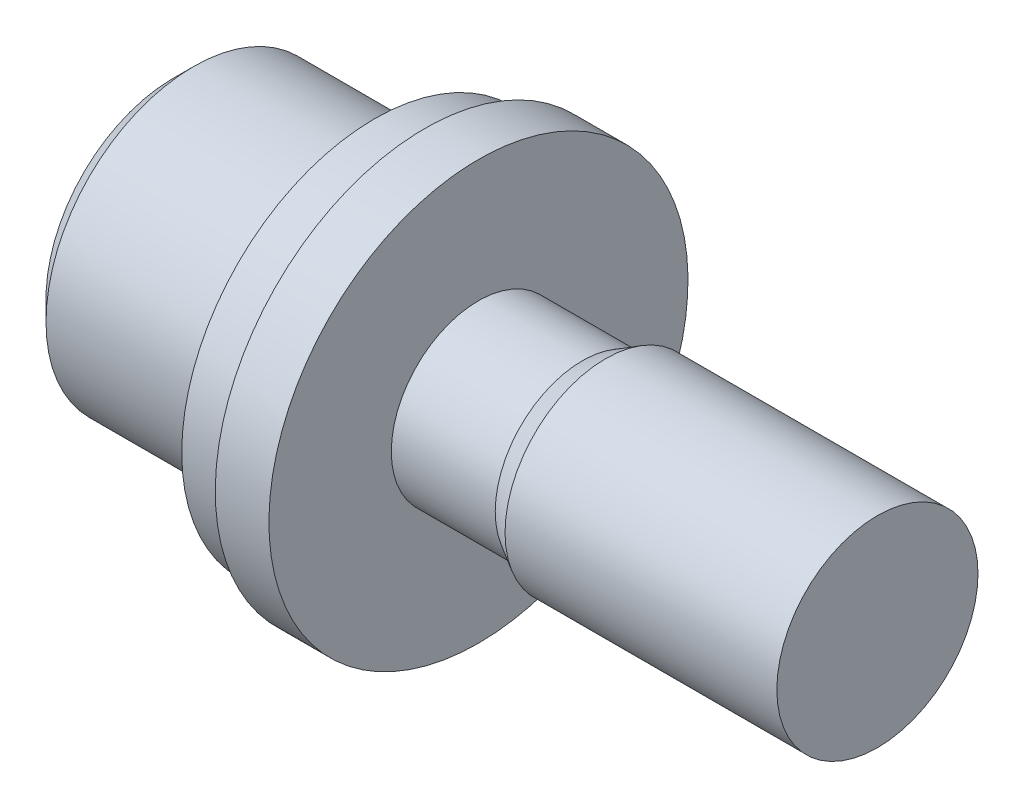
ISO-10303-21;
HEADER;
FILE_DESCRIPTION(('STEP AP214'),'2;1');
FILE_NAME('part.step','',(''),(''),'','','');
FILE_SCHEMA(('AUTOMOTIVE_DESIGN { 1 0 10303 214 1 1 1 1 }'));
ENDSEC;
DATA;
#1=APPLICATION_CONTEXT('core data for automotive mechanical design processes');
#2=APPLICATION_PROTOCOL_DEFINITION('international standard','automotive_design',2000,#1);
#3=PRODUCT_CONTEXT('',#1,'mechanical');
#4=PRODUCT('Part','Part','',(#3));
#5=PRODUCT_RELATED_PRODUCT_CATEGORY('part','',(#4));
#6=PRODUCT_DEFINITION_FORMATION('','',#4);
#7=PRODUCT_DEFINITION_CONTEXT('part definition',#1,'design');
#8=PRODUCT_DEFINITION('design','',#6,#7);
#9=PRODUCT_DEFINITION_SHAPE('','',#8);
#10=(LENGTH_UNIT() NAMED_UNIT(*) SI_UNIT(.MILLI.,.METRE.));
#11=(NAMED_UNIT(*) PLANE_ANGLE_UNIT() SI_UNIT($,.RADIAN.));
#12=(NAMED_UNIT(*) SI_UNIT($,.STERADIAN.) SOLID_ANGLE_UNIT());
#13=UNCERTAINTY_MEASURE_WITH_UNIT(LENGTH_MEASURE(1.E-05),#10,'distance_accuracy_value','');
#14=(GEOMETRIC_REPRESENTATION_CONTEXT(3) GLOBAL_UNCERTAINTY_ASSIGNED_CONTEXT((#13)) GLOBAL_UNIT_ASSIGNED_CONTEXT((#10,
#11,#12)) REPRESENTATION_CONTEXT('',''));
#15=CARTESIAN_POINT('',(0.,0.,0.));
#16=DIRECTION('',(0.,0.,1.));
#17=DIRECTION('',(1.,0.,0.));
#18=AXIS2_PLACEMENT_3D('',#15,#16,#17);
#19=CARTESIAN_POINT('',(-6.1,0.,0.));
#20=DIRECTION('',(-1.,0.,0.));
#21=DIRECTION('',(0.,0.,1.));
#22=AXIS2_PLACEMENT_3D('',#19,#20,#21);
#23=PLANE('',#22);
#24=DIRECTION('',(0.,0.499999999999984,-0.866025403784448));
#25=VECTOR('',#24,1.);
#26=CARTESIAN_POINT('',(-6.1,1.44337567297406,2.5));
#27=LINE('',#26,#25);
#28=CARTESIAN_POINT('',(-6.09999999999998,1.44337567297407,2.49999999999998));
#29=VERTEX_POINT('',#28);
#30=CARTESIAN_POINT('',(-6.10000000000177,2.1650635094601,1.24999999999942));
#31=VERTEX_POINT('',#30);
#32=EDGE_CURVE('E110',#29,#31,#27,.T.);
#33=ORIENTED_EDGE('',*,*,#32,.T.);
#34=CARTESIAN_POINT('',(-6.10000000000355,0.,0.));
#35=DIRECTION('',(-1.,0.,0.));
#36=DIRECTION('',(0.,0.,1.));
#37=AXIS2_PLACEMENT_3D('',#34,#35,#36);
#38=CIRCLE('',#37,2.49999999999773);
#39=CARTESIAN_POINT('',(-6.10000000000177,0.,2.49999999999885));
#40=VERTEX_POINT('',#39);
#41=EDGE_CURVE('E20',#31,#40,#38,.F.);
#42=ORIENTED_EDGE('',*,*,#41,.T.);
#43=DIRECTION('',(0.,1.,0.));
#44=VECTOR('',#43,1.);
#45=CARTESIAN_POINT('',(-6.1,0.,2.49999999999997));
#46=LINE('',#45,#44);
#47=EDGE_CURVE('E111',#40,#29,#46,.T.);
#48=ORIENTED_EDGE('',*,*,#47,.T.);
#49=EDGE_LOOP('',(#33,#42,#48));
#50=FACE_BOUND('',#49,.T.);
#51=ADVANCED_FACE('F17',(#50),#23,.T.);
#52=CARTESIAN_POINT('',(-6.1,0.,0.));
#53=DIRECTION('',(-1.,0.,0.));
#54=DIRECTION('',(0.,0.,1.));
#55=AXIS2_PLACEMENT_3D('',#52,#53,#54);
#56=PLANE('',#55);
#57=DIRECTION('',(0.,1.,0.));
#58=VECTOR('',#57,1.);
#59=CARTESIAN_POINT('',(-6.1,0.,2.5));
#60=LINE('',#59,#58);
#61=CARTESIAN_POINT('',(-6.09999999999998,-1.44337567297406,2.5));
#62=VERTEX_POINT('',#61);
#63=EDGE_CURVE('E89',#62,#40,#60,.T.);
#64=ORIENTED_EDGE('',*,*,#63,.T.);
#65=CARTESIAN_POINT('',(-6.10000000000355,0.,0.));
#66=DIRECTION('',(-1.,0.,0.));
#67=DIRECTION('',(0.,0.,1.));
#68=AXIS2_PLACEMENT_3D('',#65,#66,#67);
#69=CIRCLE('',#68,2.49999999999773);
#70=CARTESIAN_POINT('',(-6.10000000000177,-2.1650635094601,1.24999999999942));
#71=VERTEX_POINT('',#70);
#72=EDGE_CURVE('E121',#40,#71,#69,.F.);
#73=ORIENTED_EDGE('',*,*,#72,.T.);
#74=DIRECTION('',(0.,0.499999999999984,0.866025403784448));
#75=VECTOR('',#74,1.);
#76=CARTESIAN_POINT('',(-6.1,-2.16506350946107,1.24999999999999));
#77=LINE('',#76,#75);
#78=EDGE_CURVE('E112',#71,#62,#77,.T.);
#79=ORIENTED_EDGE('',*,*,#78,.T.);
#80=EDGE_LOOP('',(#64,#73,#79));
#81=FACE_BOUND('',#80,.T.);
#82=ADVANCED_FACE('F185',(#81),#56,.T.);
#83=CARTESIAN_POINT('',(-6.1,0.,0.));
#84=DIRECTION('',(-1.,0.,0.));
#85=DIRECTION('',(0.,0.,1.));
#86=AXIS2_PLACEMENT_3D('',#83,#84,#85);
#87=PLANE('',#86);
#88=DIRECTION('',(0.,-0.499999999999985,0.866025403784448));
#89=VECTOR('',#88,1.);
#90=CARTESIAN_POINT('',(-6.1,-1.44337567297406,-2.5));
#91=LINE('',#90,#89);
#92=CARTESIAN_POINT('',(-6.09999999999998,-1.44337567297407,-2.49999999999998));
#93=VERTEX_POINT('',#92);
#94=CARTESIAN_POINT('',(-6.10000000000177,-2.1650635094601,-1.24999999999942));
#95=VERTEX_POINT('',#94);
#96=EDGE_CURVE('E122',#93,#95,#91,.T.);
#97=ORIENTED_EDGE('',*,*,#96,.T.);
#98=CARTESIAN_POINT('',(-6.10000000000355,0.,0.));
#99=DIRECTION('',(-1.,0.,0.));
#100=DIRECTION('',(0.,0.,1.));
#101=AXIS2_PLACEMENT_3D('',#98,#99,#100);
#102=CIRCLE('',#101,2.49999999999773);
#103=CARTESIAN_POINT('',(-6.10000000000177,0.,-2.49999999999885));
#104=VERTEX_POINT('',#103);
#105=EDGE_CURVE('E106',#95,#104,#102,.F.);
#106=ORIENTED_EDGE('',*,*,#105,.T.);
#107=DIRECTION('',(0.,1.,0.));
#108=VECTOR('',#107,1.);
#109=CARTESIAN_POINT('',(-6.1,0.,-2.49999999999997));
#110=LINE('',#109,#108);
#111=EDGE_CURVE('E124',#104,#93,#110,.F.);
#112=ORIENTED_EDGE('',*,*,#111,.T.);
#113=EDGE_LOOP('',(#97,#106,#112));
#114=FACE_BOUND('',#113,.T.);
#115=ADVANCED_FACE('F187',(#114),#87,.T.);
#116=CARTESIAN_POINT('',(-6.10000000000355,0.,0.));
#117=DIRECTION('',(-1.,0.,0.));
#118=DIRECTION('',(0.,0.,1.));
#119=AXIS2_PLACEMENT_3D('',#116,#117,#118);
#120=CONICAL_SURFACE('',#119,2.49999999999773,1.04719755112176);
#121=CARTESIAN_POINT('',(-4.65662432699787,5.68431684750416E-11,0.));
#122=VERTEX_POINT('',#121);
#123=VERTEX_LOOP('',#122);
#124=FACE_BOUND('',#123,.T.);
#125=ORIENTED_EDGE('',*,*,#41,.F.);
#126=CARTESIAN_POINT('',(-6.10000000000355,0.,0.));
#127=DIRECTION('',(-1.,0.,0.));
#128=DIRECTION('',(0.,0.,1.));
#129=AXIS2_PLACEMENT_3D('',#126,#127,#128);
#130=CIRCLE('',#129,2.49999999999773);
#131=CARTESIAN_POINT('',(-6.10000000000169,2.16506350946011,-1.24999999999943));
#132=VERTEX_POINT('',#131);
#133=EDGE_CURVE('E95',#132,#31,#130,.F.);
#134=ORIENTED_EDGE('',*,*,#133,.F.);
#135=CARTESIAN_POINT('',(-6.10000000000355,0.,0.));
#136=DIRECTION('',(-1.,0.,0.));
#137=DIRECTION('',(0.,0.,1.));
#138=AXIS2_PLACEMENT_3D('',#135,#136,#137);
#139=CIRCLE('',#138,2.49999999999773);
#140=EDGE_CURVE('E171',#104,#132,#139,.F.);
#141=ORIENTED_EDGE('',*,*,#140,.F.);
#142=ORIENTED_EDGE('',*,*,#105,.F.);
#143=CARTESIAN_POINT('',(-6.10000000000355,0.,0.));
#144=DIRECTION('',(-1.,0.,0.));
#145=DIRECTION('',(0.,0.,1.));
#146=AXIS2_PLACEMENT_3D('',#143,#144,#145);
#147=CIRCLE('',#146,2.49999999999773);
#148=EDGE_CURVE('E123',#71,#95,#147,.F.);
#149=ORIENTED_EDGE('',*,*,#148,.F.);
#150=ORIENTED_EDGE('',*,*,#72,.F.);
#151=EDGE_LOOP('',(#125,#134,#141,#142,#149,#150));
#152=FACE_BOUND('',#151,.T.);
#153=ADVANCED_FACE('F120',(#124,#152),#120,.F.);
#154=CARTESIAN_POINT('',(-6.1,0.,0.));
#155=DIRECTION('',(-1.,0.,0.));
#156=DIRECTION('',(0.,0.,1.));
#157=AXIS2_PLACEMENT_3D('',#154,#155,#156);
#158=PLANE('',#157);
#159=DIRECTION('',(0.,1.,0.));
#160=VECTOR('',#159,1.);
#161=CARTESIAN_POINT('',(-6.1,0.,-2.5));
#162=LINE('',#161,#160);
#163=CARTESIAN_POINT('',(-6.09999999999992,1.44337567297406,-2.5));
#164=VERTEX_POINT('',#163);
#165=EDGE_CURVE('E105',#164,#104,#162,.F.);
#166=ORIENTED_EDGE('',*,*,#165,.T.);
#167=ORIENTED_EDGE('',*,*,#140,.T.);
#168=DIRECTION('',(0.,0.5,0.866025403784438));
#169=VECTOR('',#168,1.);
#170=CARTESIAN_POINT('',(-6.09999999999984,2.88675134594813,0.));
#171=LINE('',#170,#169);
#172=EDGE_CURVE('E441',#132,#164,#171,.F.);
#173=ORIENTED_EDGE('',*,*,#172,.T.);
#174=EDGE_LOOP('',(#166,#167,#173));
#175=FACE_BOUND('',#174,.T.);
#176=ADVANCED_FACE('F271',(#175),#158,.T.);
#177=CARTESIAN_POINT('',(-6.1,0.,0.));
#178=DIRECTION('',(-1.,0.,0.));
#179=DIRECTION('',(0.,0.,1.));
#180=AXIS2_PLACEMENT_3D('',#177,#178,#179);
#181=PLANE('',#180);
#182=DIRECTION('',(0.,-0.5,-0.866025403784439));
#183=VECTOR('',#182,1.);
#184=CARTESIAN_POINT('',(-6.1,-2.88675134594813,0.));
#185=LINE('',#184,#183);
#186=CARTESIAN_POINT('',(-6.09999999999995,-2.88675134594813,0.));
#187=VERTEX_POINT('',#186);
#188=EDGE_CURVE('E145',#187,#71,#185,.F.);
#189=ORIENTED_EDGE('',*,*,#188,.T.);
#190=ORIENTED_EDGE('',*,*,#148,.T.);
#191=DIRECTION('',(0.,0.5,-0.866025403784439));
#192=VECTOR('',#191,1.);
#193=CARTESIAN_POINT('',(-6.09999999999984,-1.44337567297406,-2.5));
#194=LINE('',#193,#192);
#195=EDGE_CURVE('E141',#95,#187,#194,.F.);
#196=ORIENTED_EDGE('',*,*,#195,.T.);
#197=EDGE_LOOP('',(#189,#190,#196));
#198=FACE_BOUND('',#197,.T.);
#199=ADVANCED_FACE('F177',(#198),#181,.T.);
#200=CARTESIAN_POINT('',(-6.1,0.,0.));
#201=DIRECTION('',(-1.,0.,0.));
#202=DIRECTION('',(0.,0.,1.));
#203=AXIS2_PLACEMENT_3D('',#200,#201,#202);
#204=PLANE('',#203);
#205=ORIENTED_EDGE('',*,*,#133,.T.);
#206=DIRECTION('',(0.,-0.5,0.866025403784439));
#207=VECTOR('',#206,1.);
#208=CARTESIAN_POINT('',(-6.09999999999984,1.44337567297406,2.5));
#209=LINE('',#208,#207);
#210=CARTESIAN_POINT('',(-6.09999999999992,2.88675134594813,0.));
#211=VERTEX_POINT('',#210);
#212=EDGE_CURVE('E99',#31,#211,#209,.F.);
#213=ORIENTED_EDGE('',*,*,#212,.T.);
#214=DIRECTION('',(0.,0.5,0.866025403784438));
#215=VECTOR('',#214,1.);
#216=CARTESIAN_POINT('',(-6.1,2.88675134594813,0.));
#217=LINE('',#216,#215);
#218=EDGE_CURVE('E100',#211,#132,#217,.F.);
#219=ORIENTED_EDGE('',*,*,#218,.T.);
#220=EDGE_LOOP('',(#205,#213,#219));
#221=FACE_BOUND('',#220,.T.);
#222=ADVANCED_FACE('F97',(#221),#204,.T.);
#223=CARTESIAN_POINT('',(-6.1,2.88675134594813,0.));
#224=DIRECTION('',(0.,0.866025403784438,-0.5));
#225=DIRECTION('',(0.,0.5,0.866025403784438));
#226=AXIS2_PLACEMENT_3D('',#223,#224,#225);
#227=PLANE('',#226);
#228=ORIENTED_EDGE('',*,*,#172,.F.);
#229=ORIENTED_EDGE('',*,*,#218,.F.);
#230=DIRECTION('',(1.,0.,0.));
#231=VECTOR('',#230,1.);
#232=CARTESIAN_POINT('',(-6.1,2.88675134594813,0.));
#233=LINE('',#232,#231);
#234=CARTESIAN_POINT('',(-9.1,2.88675134594813,0.));
#235=VERTEX_POINT('',#234);
#236=EDGE_CURVE('E117',#211,#235,#233,.F.);
#237=ORIENTED_EDGE('',*,*,#236,.T.);
#238=DIRECTION('',(0.,-0.5,-0.866025403784438));
#239=VECTOR('',#238,1.);
#240=CARTESIAN_POINT('',(-9.1,2.88675134594813,0.));
#241=LINE('',#240,#239);
#242=CARTESIAN_POINT('',(-9.1,1.44337567297406,-2.5));
#243=VERTEX_POINT('',#242);
#244=EDGE_CURVE('E460',#235,#243,#241,.T.);
#245=ORIENTED_EDGE('',*,*,#244,.T.);
#246=DIRECTION('',(-1.,0.,0.));
#247=VECTOR('',#246,1.);
#248=CARTESIAN_POINT('',(-6.1,1.44337567297406,-2.5));
#249=LINE('',#248,#247);
#250=EDGE_CURVE('E132',#243,#164,#249,.F.);
#251=ORIENTED_EDGE('',*,*,#250,.T.);
#252=EDGE_LOOP('',(#228,#229,#237,#245,#251));
#253=FACE_BOUND('',#252,.T.);
#254=ADVANCED_FACE('F262',(#253),#227,.F.);
#255=CARTESIAN_POINT('',(-6.1,1.44337567297406,-2.5));
#256=DIRECTION('',(0.,0.,-1.));
#257=DIRECTION('',(-1.,0.,0.));
#258=AXIS2_PLACEMENT_3D('',#255,#256,#257);
#259=PLANE('',#258);
#260=ORIENTED_EDGE('',*,*,#111,.F.);
#261=ORIENTED_EDGE('',*,*,#165,.F.);
#262=ORIENTED_EDGE('',*,*,#250,.F.);
#263=DIRECTION('',(0.,1.,0.));
#264=VECTOR('',#263,1.);
#265=CARTESIAN_POINT('',(-9.1,4.399,-2.5));
#266=LINE('',#265,#264);
#267=CARTESIAN_POINT('',(-9.1,-1.44337567297406,-2.5));
#268=VERTEX_POINT('',#267);
#269=EDGE_CURVE('E446',#243,#268,#266,.F.);
#270=ORIENTED_EDGE('',*,*,#269,.T.);
#271=DIRECTION('',(1.,0.,0.));
#272=VECTOR('',#271,1.);
#273=CARTESIAN_POINT('',(-6.1,-1.44337567297406,-2.5));
#274=LINE('',#273,#272);
#275=EDGE_CURVE('E138',#268,#93,#274,.T.);
#276=ORIENTED_EDGE('',*,*,#275,.T.);
#277=EDGE_LOOP('',(#260,#261,#262,#270,#276));
#278=FACE_BOUND('',#277,.T.);
#279=ADVANCED_FACE('F258',(#278),#259,.F.);
#280=CARTESIAN_POINT('',(-6.1,-1.44337567297406,-2.5));
#281=DIRECTION('',(0.,-0.866025403784439,-0.5));
#282=DIRECTION('',(0.,0.5,-0.866025403784439));
#283=AXIS2_PLACEMENT_3D('',#280,#281,#282);
#284=PLANE('',#283);
#285=ORIENTED_EDGE('',*,*,#195,.F.);
#286=ORIENTED_EDGE('',*,*,#96,.F.);
#287=ORIENTED_EDGE('',*,*,#275,.F.);
#288=DIRECTION('',(0.,-0.5,0.866025403784439));
#289=VECTOR('',#288,1.);
#290=CARTESIAN_POINT('',(-9.1,-1.44337567297406,-2.5));
#291=LINE('',#290,#289);
#292=CARTESIAN_POINT('',(-9.1,-2.88675134594813,0.));
#293=VERTEX_POINT('',#292);
#294=EDGE_CURVE('E457',#268,#293,#291,.T.);
#295=ORIENTED_EDGE('',*,*,#294,.T.);
#296=DIRECTION('',(1.,0.,0.));
#297=VECTOR('',#296,1.);
#298=CARTESIAN_POINT('',(-6.1,-2.88675134594813,0.));
#299=LINE('',#298,#297);
#300=EDGE_CURVE('E449',#293,#187,#299,.T.);
#301=ORIENTED_EDGE('',*,*,#300,.T.);
#302=EDGE_LOOP('',(#285,#286,#287,#295,#301));
#303=FACE_BOUND('',#302,.T.);
#304=ADVANCED_FACE('F255',(#303),#284,.F.);
#305=CARTESIAN_POINT('',(-6.1,-2.88675134594813,0.));
#306=DIRECTION('',(0.,-0.866025403784439,0.5));
#307=DIRECTION('',(0.,-0.5,-0.866025403784439));
#308=AXIS2_PLACEMENT_3D('',#305,#306,#307);
#309=PLANE('',#308);
#310=ORIENTED_EDGE('',*,*,#78,.F.);
#311=ORIENTED_EDGE('',*,*,#188,.F.);
#312=ORIENTED_EDGE('',*,*,#300,.F.);
#313=DIRECTION('',(0.,0.5,0.866025403784439));
#314=VECTOR('',#313,1.);
#315=CARTESIAN_POINT('',(-9.1,-2.88675134594813,0.));
#316=LINE('',#315,#314);
#317=CARTESIAN_POINT('',(-9.1,-1.44337567297406,2.5));
#318=VERTEX_POINT('',#317);
#319=EDGE_CURVE('E454',#293,#318,#316,.T.);
#320=ORIENTED_EDGE('',*,*,#319,.T.);
#321=DIRECTION('',(1.,0.,0.));
#322=VECTOR('',#321,1.);
#323=CARTESIAN_POINT('',(-6.1,-1.44337567297406,2.5));
#324=LINE('',#323,#322);
#325=EDGE_CURVE('E142',#318,#62,#324,.T.);
#326=ORIENTED_EDGE('',*,*,#325,.T.);
#327=EDGE_LOOP('',(#310,#311,#312,#320,#326));
#328=FACE_BOUND('',#327,.T.);
#329=ADVANCED_FACE('F182',(#328),#309,.F.);
#330=CARTESIAN_POINT('',(-6.1,-1.44337567297406,2.5));
#331=DIRECTION('',(0.,0.,1.));
#332=DIRECTION('',(0.,-1.,0.));
#333=AXIS2_PLACEMENT_3D('',#330,#331,#332);
#334=PLANE('',#333);
#335=ORIENTED_EDGE('',*,*,#47,.F.);
#336=ORIENTED_EDGE('',*,*,#63,.F.);
#337=ORIENTED_EDGE('',*,*,#325,.F.);
#338=DIRECTION('',(0.,1.,0.));
#339=VECTOR('',#338,1.);
#340=CARTESIAN_POINT('',(-9.1,4.399,2.5));
#341=LINE('',#340,#339);
#342=CARTESIAN_POINT('',(-9.1,1.44337567297406,2.5));
#343=VERTEX_POINT('',#342);
#344=EDGE_CURVE('E456',#318,#343,#341,.T.);
#345=ORIENTED_EDGE('',*,*,#344,.T.);
#346=DIRECTION('',(1.,0.,0.));
#347=VECTOR('',#346,1.);
#348=CARTESIAN_POINT('',(-6.1,1.44337567297406,2.5));
#349=LINE('',#348,#347);
#350=EDGE_CURVE('E35',#343,#29,#349,.T.);
#351=ORIENTED_EDGE('',*,*,#350,.T.);
#352=EDGE_LOOP('',(#335,#336,#337,#345,#351));
#353=FACE_BOUND('',#352,.T.);
#354=ADVANCED_FACE('F249',(#353),#334,.F.);
#355=CARTESIAN_POINT('',(-6.1,1.44337567297406,2.5));
#356=DIRECTION('',(0.,0.866025403784439,0.5));
#357=DIRECTION('',(0.,-0.5,0.866025403784439));
#358=AXIS2_PLACEMENT_3D('',#355,#356,#357);
#359=PLANE('',#358);
#360=ORIENTED_EDGE('',*,*,#212,.F.);
#361=ORIENTED_EDGE('',*,*,#32,.F.);
#362=ORIENTED_EDGE('',*,*,#350,.F.);
#363=DIRECTION('',(0.,0.5,-0.866025403784439));
#364=VECTOR('',#363,1.);
#365=CARTESIAN_POINT('',(-9.1,1.44337567297406,2.5));
#366=LINE('',#365,#364);
#367=EDGE_CURVE('E170',#343,#235,#366,.T.);
#368=ORIENTED_EDGE('',*,*,#367,.T.);
#369=ORIENTED_EDGE('',*,*,#236,.F.);
#370=EDGE_LOOP('',(#360,#361,#362,#368,#369));
#371=FACE_BOUND('',#370,.T.);
#372=ADVANCED_FACE('F115',(#371),#359,.F.);
#373=CARTESIAN_POINT('',(-9.1,4.399,0.));
#374=DIRECTION('',(1.,0.,0.));
#375=DIRECTION('',(0.,1.,0.));
#376=AXIS2_PLACEMENT_3D('',#373,#374,#375);
#377=PLANE('',#376);
#378=CARTESIAN_POINT('',(-9.10000000004629,0.,0.));
#379=DIRECTION('',(1.,0.,0.));
#380=DIRECTION('',(0.,0.,-1.));
#381=AXIS2_PLACEMENT_3D('',#378,#379,#380);
#382=CIRCLE('',#381,3.7989999999013);
#383=CARTESIAN_POINT('',(-9.10000000004629,0.,-3.7989999999013));
#384=VERTEX_POINT('',#383);
#385=EDGE_CURVE('E167',#384,#384,#382,.T.);
#386=ORIENTED_EDGE('',*,*,#385,.F.);
#387=EDGE_LOOP('',(#386));
#388=FACE_BOUND('',#387,.T.);
#389=ORIENTED_EDGE('',*,*,#344,.F.);
#390=ORIENTED_EDGE('',*,*,#319,.F.);
#391=ORIENTED_EDGE('',*,*,#294,.F.);
#392=ORIENTED_EDGE('',*,*,#269,.F.);
#393=ORIENTED_EDGE('',*,*,#244,.F.);
#394=ORIENTED_EDGE('',*,*,#367,.F.);
#395=EDGE_LOOP('',(#389,#390,#391,#392,#393,#394));
#396=FACE_BOUND('',#395,.T.);
#397=ADVANCED_FACE('F242',(#388,#396),#377,.F.);
#398=CARTESIAN_POINT('',(-8.50000000008322,0.,0.));
#399=DIRECTION('',(1.,0.,0.));
#400=DIRECTION('',(0.,0.,-1.));
#401=AXIS2_PLACEMENT_3D('',#398,#399,#400);
#402=CONICAL_SURFACE('',#401,4.39899999986437,0.785398163397448);
#403=ORIENTED_EDGE('',*,*,#385,.T.);
#404=EDGE_LOOP('',(#403));
#405=FACE_BOUND('',#404,.T.);
#406=CARTESIAN_POINT('',(-8.5,0.,0.));
#407=DIRECTION('',(-1.,0.,0.));
#408=DIRECTION('',(0.,-1.,0.));
#409=AXIS2_PLACEMENT_3D('',#406,#407,#408);
#410=CIRCLE('',#409,4.399);
#411=CARTESIAN_POINT('',(-8.5,-4.399,0.));
#412=VERTEX_POINT('',#411);
#413=EDGE_CURVE('E166',#412,#412,#410,.F.);
#414=ORIENTED_EDGE('',*,*,#413,.F.);
#415=EDGE_LOOP('',(#414));
#416=FACE_BOUND('',#415,.T.);
#417=ADVANCED_FACE('F238',(#405,#416),#402,.T.);
#418=CARTESIAN_POINT('',(-9.1,0.,0.));
#419=DIRECTION('',(-1.,0.,0.));
#420=DIRECTION('',(0.,-1.,0.));
#421=AXIS2_PLACEMENT_3D('',#418,#419,#420);
#422=CYLINDRICAL_SURFACE('',#421,4.399);
#423=ORIENTED_EDGE('',*,*,#413,.T.);
#424=EDGE_LOOP('',(#423));
#425=FACE_BOUND('',#424,.T.);
#426=CARTESIAN_POINT('',(-3.1,0.,0.));
#427=DIRECTION('',(-1.,0.,0.));
#428=DIRECTION('',(0.,-1.,0.));
#429=AXIS2_PLACEMENT_3D('',#426,#427,#428);
#430=CIRCLE('',#429,4.399);
#431=CARTESIAN_POINT('',(-3.1,-4.399,0.));
#432=VERTEX_POINT('',#431);
#433=EDGE_CURVE('E163',#432,#432,#430,.T.);
#434=ORIENTED_EDGE('',*,*,#433,.T.);
#435=EDGE_LOOP('',(#434));
#436=FACE_BOUND('',#435,.T.);
#437=ADVANCED_FACE('F234',(#425,#436),#422,.T.);
#438=CARTESIAN_POINT('',(-3.1,5.75,0.));
#439=DIRECTION('',(1.,0.,0.));
#440=DIRECTION('',(0.,1.,0.));
#441=AXIS2_PLACEMENT_3D('',#438,#439,#440);
#442=PLANE('',#441);
#443=ORIENTED_EDGE('',*,*,#433,.F.);
#444=EDGE_LOOP('',(#443));
#445=FACE_BOUND('',#444,.T.);
#446=CARTESIAN_POINT('',(-3.1,0.,0.));
#447=DIRECTION('',(-1.,0.,0.));
#448=DIRECTION('',(0.,-1.,0.));
#449=AXIS2_PLACEMENT_3D('',#446,#447,#448);
#450=CIRCLE('',#449,5.75);
#451=CARTESIAN_POINT('',(-3.1,-5.75,0.));
#452=VERTEX_POINT('',#451);
#453=EDGE_CURVE('E160',#452,#452,#450,.F.);
#454=ORIENTED_EDGE('',*,*,#453,.F.);
#455=EDGE_LOOP('',(#454));
#456=FACE_BOUND('',#455,.T.);
#457=ADVANCED_FACE('F230',(#445,#456),#442,.F.);
#458=CARTESIAN_POINT('',(11.9,3.,0.));
#459=DIRECTION('',(-1.,0.,0.));
#460=DIRECTION('',(0.,-1.,0.));
#461=AXIS2_PLACEMENT_3D('',#458,#459,#460);
#462=PLANE('',#461);
#463=CARTESIAN_POINT('',(11.9,0.,0.));
#464=DIRECTION('',(-1.,0.,0.));
#465=DIRECTION('',(0.,0.,1.));
#466=AXIS2_PLACEMENT_3D('',#463,#464,#465);
#467=CIRCLE('',#466,3.);
#468=CARTESIAN_POINT('',(11.9,0.,3.));
#469=VERTEX_POINT('',#468);
#470=EDGE_CURVE('E157',#469,#469,#467,.T.);
#471=ORIENTED_EDGE('',*,*,#470,.F.);
#472=EDGE_LOOP('',(#471));
#473=FACE_BOUND('',#472,.T.);
#474=ADVANCED_FACE('F226',(#473),#462,.F.);
#475=CARTESIAN_POINT('',(-9.1,0.,0.));
#476=DIRECTION('',(-1.,0.,0.));
#477=DIRECTION('',(0.,-1.,0.));
#478=AXIS2_PLACEMENT_3D('',#475,#476,#477);
#479=CYLINDRICAL_SURFACE('',#478,5.75);
#480=ORIENTED_EDGE('',*,*,#453,.T.);
#481=EDGE_LOOP('',(#480));
#482=FACE_BOUND('',#481,.T.);
#483=CARTESIAN_POINT('',(-1.6,0.,0.));
#484=DIRECTION('',(-1.,0.,0.));
#485=DIRECTION('',(0.,-1.,0.));
#486=AXIS2_PLACEMENT_3D('',#483,#484,#485);
#487=CIRCLE('',#486,5.75);
#488=CARTESIAN_POINT('',(-1.6,-5.75,0.));
#489=VERTEX_POINT('',#488);
#490=EDGE_CURVE('E154',#489,#489,#487,.T.);
#491=ORIENTED_EDGE('',*,*,#490,.T.);
#492=EDGE_LOOP('',(#491));
#493=FACE_BOUND('',#492,.T.);
#494=ADVANCED_FACE('F222',(#482,#493),#479,.T.);
#495=CARTESIAN_POINT('',(-7.14838709677419,0.,0.));
#496=DIRECTION('',(-1.,0.,0.));
#497=DIRECTION('',(0.,0.,1.));
#498=AXIS2_PLACEMENT_3D('',#495,#496,#497);
#499=CYLINDRICAL_SURFACE('',#498,3.);
#500=CARTESIAN_POINT('',(3.79282032298533,0.,0.));
#501=DIRECTION('',(1.,0.,0.));
#502=DIRECTION('',(0.,0.,-1.));
#503=AXIS2_PLACEMENT_3D('',#500,#501,#502);
#504=CIRCLE('',#503,2.9999999999859);
#505=CARTESIAN_POINT('',(3.79282032298534,0.,-2.9999999999859));
#506=VERTEX_POINT('',#505);
#507=EDGE_CURVE('E153',#506,#506,#504,.F.);
#508=ORIENTED_EDGE('',*,*,#507,.F.);
#509=EDGE_LOOP('',(#508));
#510=FACE_BOUND('',#509,.T.);
#511=ORIENTED_EDGE('',*,*,#470,.T.);
#512=EDGE_LOOP('',(#511));
#513=FACE_BOUND('',#512,.T.);
#514=ADVANCED_FACE('F218',(#510,#513),#499,.T.);
#515=CARTESIAN_POINT('',(-1.6,5.75,0.));
#516=DIRECTION('',(1.,0.,0.));
#517=DIRECTION('',(0.,1.,0.));
#518=AXIS2_PLACEMENT_3D('',#515,#516,#517);
#519=PLANE('',#518);
#520=ORIENTED_EDGE('',*,*,#490,.F.);
#521=EDGE_LOOP('',(#520));
#522=FACE_BOUND('',#521,.T.);
#523=CARTESIAN_POINT('',(-1.6,0.,0.));
#524=DIRECTION('',(-1.,0.,0.));
#525=DIRECTION('',(0.,-1.,0.));
#526=AXIS2_PLACEMENT_3D('',#523,#524,#525);
#527=CIRCLE('',#526,6.25);
#528=CARTESIAN_POINT('',(-1.6,-6.25,0.));
#529=VERTEX_POINT('',#528);
#530=EDGE_CURVE('E150',#529,#529,#527,.F.);
#531=ORIENTED_EDGE('',*,*,#530,.F.);
#532=EDGE_LOOP('',(#531));
#533=FACE_BOUND('',#532,.T.);
#534=ADVANCED_FACE('F214',(#522,#533),#519,.F.);
#535=CARTESIAN_POINT('',(3.79282032287165,0.,0.));
#536=DIRECTION('',(1.,0.,0.));
#537=DIRECTION('',(0.,0.,-1.));
#538=AXIS2_PLACEMENT_3D('',#535,#536,#537);
#539=CONICAL_SURFACE('',#538,2.99999999992906,0.523598775614559);
#540=ORIENTED_EDGE('',*,*,#507,.T.);
#541=EDGE_LOOP('',(#540));
#542=FACE_BOUND('',#541,.T.);
#543=CARTESIAN_POINT('',(3.1,0.,0.));
#544=DIRECTION('',(-1.,0.,0.));
#545=DIRECTION('',(0.,0.,1.));
#546=AXIS2_PLACEMENT_3D('',#543,#544,#545);
#547=CIRCLE('',#546,2.6);
#548=CARTESIAN_POINT('',(3.1,0.,2.6));
#549=VERTEX_POINT('',#548);
#550=EDGE_CURVE('E149',#549,#549,#547,.T.);
#551=ORIENTED_EDGE('',*,*,#550,.F.);
#552=EDGE_LOOP('',(#551));
#553=FACE_BOUND('',#552,.T.);
#554=ADVANCED_FACE('F210',(#542,#553),#539,.T.);
#555=CARTESIAN_POINT('',(-9.1,0.,0.));
#556=DIRECTION('',(-1.,0.,0.));
#557=DIRECTION('',(0.,-1.,0.));
#558=AXIS2_PLACEMENT_3D('',#555,#556,#557);
#559=CYLINDRICAL_SURFACE('',#558,6.25);
#560=ORIENTED_EDGE('',*,*,#530,.T.);
#561=EDGE_LOOP('',(#560));
#562=FACE_BOUND('',#561,.T.);
#563=CARTESIAN_POINT('',(0.,0.,0.));
#564=DIRECTION('',(-1.,0.,0.));
#565=DIRECTION('',(0.,-1.,0.));
#566=AXIS2_PLACEMENT_3D('',#563,#564,#565);
#567=CIRCLE('',#566,6.25);
#568=CARTESIAN_POINT('',(0.,-6.25,0.));
#569=VERTEX_POINT('',#568);
#570=EDGE_CURVE('E26',#569,#569,#567,.T.);
#571=ORIENTED_EDGE('',*,*,#570,.T.);
#572=EDGE_LOOP('',(#571));
#573=FACE_BOUND('',#572,.T.);
#574=ADVANCED_FACE('F202',(#562,#573),#559,.T.);
#575=CARTESIAN_POINT('',(-7.14838709677419,0.,0.));
#576=DIRECTION('',(-1.,0.,0.));
#577=DIRECTION('',(0.,0.,1.));
#578=AXIS2_PLACEMENT_3D('',#575,#576,#577);
#579=CYLINDRICAL_SURFACE('',#578,2.6);
#580=CARTESIAN_POINT('',(0.,0.,0.));
#581=DIRECTION('',(-1.,0.,0.));
#582=DIRECTION('',(0.,0.,1.));
#583=AXIS2_PLACEMENT_3D('',#580,#581,#582);
#584=CIRCLE('',#583,2.6);
#585=CARTESIAN_POINT('',(0.,0.,2.6));
#586=VERTEX_POINT('',#585);
#587=EDGE_CURVE('E10',#586,#586,#584,.F.);
#588=ORIENTED_EDGE('',*,*,#587,.T.);
#589=EDGE_LOOP('',(#588));
#590=FACE_BOUND('',#589,.T.);
#591=ORIENTED_EDGE('',*,*,#550,.T.);
#592=EDGE_LOOP('',(#591));
#593=FACE_BOUND('',#592,.T.);
#594=ADVANCED_FACE('F196',(#590,#593),#579,.T.);
#595=CARTESIAN_POINT('',(0.,2.6,0.));
#596=DIRECTION('',(-1.,0.,0.));
#597=DIRECTION('',(0.,-1.,0.));
#598=AXIS2_PLACEMENT_3D('',#595,#596,#597);
#599=PLANE('',#598);
#600=ORIENTED_EDGE('',*,*,#587,.F.);
#601=EDGE_LOOP('',(#600));
#602=FACE_BOUND('',#601,.T.);
#603=ORIENTED_EDGE('',*,*,#570,.F.);
#604=EDGE_LOOP('',(#603));
#605=FACE_BOUND('',#604,.T.);
#606=ADVANCED_FACE('F194',(#602,#605),#599,.F.);
#607=CLOSED_SHELL('',(#51,#82,#115,#153,#176,#199,#222,#254,#279,#304,#329,#354,#372,#397,#417,
#437,#457,#474,#494,#514,#534,#554,#574,#594,#606));
#608=MANIFOLD_SOLID_BREP('B1',#607);
#609=ADVANCED_BREP_SHAPE_REPRESENTATION('',(#18,#608),#14);
#610=SHAPE_DEFINITION_REPRESENTATION(#9,#609);
ENDSEC;
END-ISO-10303-21;
